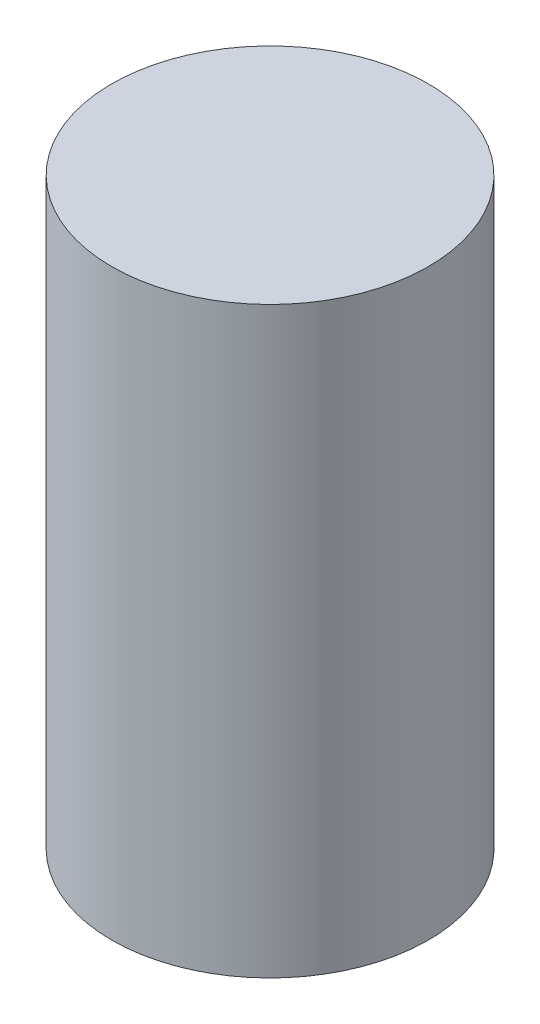
ISO-10303-21;
HEADER;
FILE_DESCRIPTION(('STEP AP214'),'2;1');
FILE_NAME('part.step','',(''),(''),'','','');
FILE_SCHEMA(('AUTOMOTIVE_DESIGN { 1 0 10303 214 1 1 1 1 }'));
ENDSEC;
DATA;
#1=APPLICATION_CONTEXT('core data for automotive mechanical design processes');
#2=APPLICATION_PROTOCOL_DEFINITION('international standard','automotive_design',2000,#1);
#3=PRODUCT_CONTEXT('',#1,'mechanical');
#4=PRODUCT('Part','Part','',(#3));
#5=PRODUCT_RELATED_PRODUCT_CATEGORY('part','',(#4));
#6=PRODUCT_DEFINITION_FORMATION('','',#4);
#7=PRODUCT_DEFINITION_CONTEXT('part definition',#1,'design');
#8=PRODUCT_DEFINITION('design','',#6,#7);
#9=PRODUCT_DEFINITION_SHAPE('','',#8);
#10=(LENGTH_UNIT() NAMED_UNIT(*) SI_UNIT(.MILLI.,.METRE.));
#11=(NAMED_UNIT(*) PLANE_ANGLE_UNIT() SI_UNIT($,.RADIAN.));
#12=(NAMED_UNIT(*) SI_UNIT($,.STERADIAN.) SOLID_ANGLE_UNIT());
#13=UNCERTAINTY_MEASURE_WITH_UNIT(LENGTH_MEASURE(1.E-05),#10,'distance_accuracy_value','');
#14=(GEOMETRIC_REPRESENTATION_CONTEXT(3) GLOBAL_UNCERTAINTY_ASSIGNED_CONTEXT((#13)) GLOBAL_UNIT_ASSIGNED_CONTEXT((#10,
#11,#12)) REPRESENTATION_CONTEXT('',''));
#15=CARTESIAN_POINT('',(0.,0.,0.));
#16=DIRECTION('',(0.,0.,1.));
#17=DIRECTION('',(1.,0.,0.));
#18=AXIS2_PLACEMENT_3D('',#15,#16,#17);
#19=CARTESIAN_POINT('',(0.,140.,0.));
#20=DIRECTION('',(0.,-1.,0.));
#21=DIRECTION('',(0.,0.,-1.));
#22=AXIS2_PLACEMENT_3D('',#19,#20,#21);
#23=CYLINDRICAL_SURFACE('',#22,38.);
#24=CARTESIAN_POINT('',(0.,140.,0.));
#25=DIRECTION('',(0.,1.,0.));
#26=DIRECTION('',(0.,0.,1.));
#27=AXIS2_PLACEMENT_3D('',#24,#25,#26);
#28=CIRCLE('',#27,38.);
#29=CARTESIAN_POINT('',(0.,140.,38.));
#30=VERTEX_POINT('',#29);
#31=EDGE_CURVE('E10',#30,#30,#28,.T.);
#32=ORIENTED_EDGE('',*,*,#31,.F.);
#33=EDGE_LOOP('',(#32));
#34=FACE_BOUND('',#33,.T.);
#35=CARTESIAN_POINT('',(0.,0.,0.));
#36=DIRECTION('',(0.,1.,0.));
#37=DIRECTION('',(0.,0.,1.));
#38=AXIS2_PLACEMENT_3D('',#35,#36,#37);
#39=CIRCLE('',#38,38.);
#40=CARTESIAN_POINT('',(0.,0.,38.));
#41=VERTEX_POINT('',#40);
#42=EDGE_CURVE('E43',#41,#41,#39,.T.);
#43=ORIENTED_EDGE('',*,*,#42,.T.);
#44=EDGE_LOOP('',(#43));
#45=FACE_BOUND('',#44,.T.);
#46=ADVANCED_FACE('F37',(#34,#45),#23,.T.);
#47=CARTESIAN_POINT('',(0.,140.,0.));
#48=DIRECTION('',(0.,1.,0.));
#49=DIRECTION('',(0.,0.,1.));
#50=AXIS2_PLACEMENT_3D('',#47,#48,#49);
#51=PLANE('',#50);
#52=ORIENTED_EDGE('',*,*,#31,.T.);
#53=EDGE_LOOP('',(#52));
#54=FACE_BOUND('',#53,.T.);
#55=ADVANCED_FACE('F71',(#54),#51,.T.);
#56=CARTESIAN_POINT('',(0.,0.,0.));
#57=DIRECTION('',(0.,1.,0.));
#58=DIRECTION('',(0.,0.,1.));
#59=AXIS2_PLACEMENT_3D('',#56,#57,#58);
#60=PLANE('',#59);
#61=CARTESIAN_POINT('',(0.,0.,0.));
#62=DIRECTION('',(0.,1.,0.));
#63=DIRECTION('',(0.,0.,1.));
#64=AXIS2_PLACEMENT_3D('',#61,#62,#63);
#65=CIRCLE('',#64,35.);
#66=CARTESIAN_POINT('',(0.,0.,35.));
#67=VERTEX_POINT('',#66);
#68=EDGE_CURVE('E51',#67,#67,#65,.T.);
#69=ORIENTED_EDGE('',*,*,#68,.T.);
#70=EDGE_LOOP('',(#69));
#71=FACE_BOUND('',#70,.T.);
#72=ORIENTED_EDGE('',*,*,#42,.F.);
#73=EDGE_LOOP('',(#72));
#74=FACE_BOUND('',#73,.T.);
#75=ADVANCED_FACE('F57',(#71,#74),#60,.F.);
#76=CARTESIAN_POINT('',(0.,140.,0.));
#77=DIRECTION('',(0.,-1.,0.));
#78=DIRECTION('',(0.,0.,-1.));
#79=AXIS2_PLACEMENT_3D('',#76,#77,#78);
#80=CYLINDRICAL_SURFACE('',#79,35.);
#81=CARTESIAN_POINT('',(0.,137.,0.));
#82=DIRECTION('',(0.,1.,0.));
#83=DIRECTION('',(0.,0.,1.));
#84=AXIS2_PLACEMENT_3D('',#81,#82,#83);
#85=CIRCLE('',#84,35.);
#86=CARTESIAN_POINT('',(0.,137.,35.));
#87=VERTEX_POINT('',#86);
#88=EDGE_CURVE('E47',#87,#87,#85,.T.);
#89=ORIENTED_EDGE('',*,*,#88,.T.);
#90=EDGE_LOOP('',(#89));
#91=FACE_BOUND('',#90,.T.);
#92=ORIENTED_EDGE('',*,*,#68,.F.);
#93=EDGE_LOOP('',(#92));
#94=FACE_BOUND('',#93,.T.);
#95=ADVANCED_FACE('F60',(#91,#94),#80,.F.);
#96=CARTESIAN_POINT('',(0.,137.,0.));
#97=DIRECTION('',(0.,1.,0.));
#98=DIRECTION('',(0.,0.,1.));
#99=AXIS2_PLACEMENT_3D('',#96,#97,#98);
#100=PLANE('',#99);
#101=ORIENTED_EDGE('',*,*,#88,.F.);
#102=EDGE_LOOP('',(#101));
#103=FACE_BOUND('',#102,.T.);
#104=ADVANCED_FACE('F62',(#103),#100,.F.);
#105=CLOSED_SHELL('',(#46,#55,#75,#95,#104));
#106=MANIFOLD_SOLID_BREP('B2',#105);
#107=ADVANCED_BREP_SHAPE_REPRESENTATION('',(#18,#106),#14);
#108=SHAPE_DEFINITION_REPRESENTATION(#9,#107);
ENDSEC;
END-ISO-10303-21;
